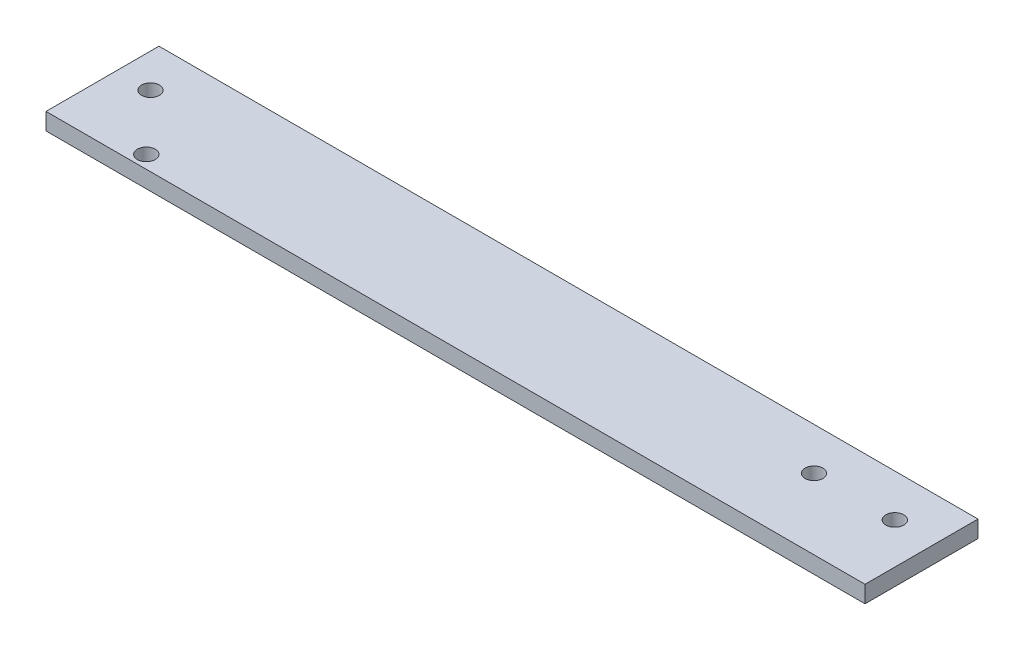
ISO-10303-21;
HEADER;
FILE_DESCRIPTION(('STEP AP214'),'2;1');
FILE_NAME('part.step','',(''),(''),'','','');
FILE_SCHEMA(('AUTOMOTIVE_DESIGN { 1 0 10303 214 1 1 1 1 }'));
ENDSEC;
DATA;
#1=APPLICATION_CONTEXT('core data for automotive mechanical design processes');
#2=APPLICATION_PROTOCOL_DEFINITION('international standard','automotive_design',2000,#1);
#3=PRODUCT_CONTEXT('',#1,'mechanical');
#4=PRODUCT('Part','Part','',(#3));
#5=PRODUCT_RELATED_PRODUCT_CATEGORY('part','',(#4));
#6=PRODUCT_DEFINITION_FORMATION('','',#4);
#7=PRODUCT_DEFINITION_CONTEXT('part definition',#1,'design');
#8=PRODUCT_DEFINITION('design','',#6,#7);
#9=PRODUCT_DEFINITION_SHAPE('','',#8);
#10=(LENGTH_UNIT() NAMED_UNIT(*) SI_UNIT(.MILLI.,.METRE.));
#11=(NAMED_UNIT(*) PLANE_ANGLE_UNIT() SI_UNIT($,.RADIAN.));
#12=(NAMED_UNIT(*) SI_UNIT($,.STERADIAN.) SOLID_ANGLE_UNIT());
#13=UNCERTAINTY_MEASURE_WITH_UNIT(LENGTH_MEASURE(1.E-05),#10,'distance_accuracy_value','');
#14=(GEOMETRIC_REPRESENTATION_CONTEXT(3) GLOBAL_UNCERTAINTY_ASSIGNED_CONTEXT((#13)) GLOBAL_UNIT_ASSIGNED_CONTEXT((#10,
#11,#12)) REPRESENTATION_CONTEXT('',''));
#15=CARTESIAN_POINT('',(0.,0.,0.));
#16=DIRECTION('',(0.,0.,1.));
#17=DIRECTION('',(1.,0.,0.));
#18=AXIS2_PLACEMENT_3D('',#15,#16,#17);
#19=CARTESIAN_POINT('',(0.,3.,20.));
#20=DIRECTION('',(-1.,0.,0.));
#21=DIRECTION('',(0.,0.,1.));
#22=AXIS2_PLACEMENT_3D('',#19,#20,#21);
#23=PLANE('',#22);
#24=DIRECTION('',(0.,0.,-1.));
#25=VECTOR('',#24,1.);
#26=CARTESIAN_POINT('',(0.,0.,20.));
#27=LINE('',#26,#25);
#28=CARTESIAN_POINT('',(0.,0.,20.));
#29=VERTEX_POINT('',#28);
#30=CARTESIAN_POINT('',(0.,0.,0.));
#31=VERTEX_POINT('',#30);
#32=EDGE_CURVE('E95',#29,#31,#27,.T.);
#33=ORIENTED_EDGE('',*,*,#32,.T.);
#34=DIRECTION('',(0.,-1.,0.));
#35=VECTOR('',#34,1.);
#36=CARTESIAN_POINT('',(0.,3.,0.));
#37=LINE('',#36,#35);
#38=CARTESIAN_POINT('',(0.,3.,0.));
#39=VERTEX_POINT('',#38);
#40=EDGE_CURVE('E11',#39,#31,#37,.T.);
#41=ORIENTED_EDGE('',*,*,#40,.F.);
#42=DIRECTION('',(0.,0.,-1.));
#43=VECTOR('',#42,1.);
#44=CARTESIAN_POINT('',(0.,3.,20.));
#45=LINE('',#44,#43);
#46=CARTESIAN_POINT('',(0.,3.,20.));
#47=VERTEX_POINT('',#46);
#48=EDGE_CURVE('E81',#47,#39,#45,.T.);
#49=ORIENTED_EDGE('',*,*,#48,.F.);
#50=DIRECTION('',(0.,-1.,0.));
#51=VECTOR('',#50,1.);
#52=CARTESIAN_POINT('',(0.,3.,20.));
#53=LINE('',#52,#51);
#54=EDGE_CURVE('E91',#47,#29,#53,.T.);
#55=ORIENTED_EDGE('',*,*,#54,.T.);
#56=EDGE_LOOP('',(#33,#41,#49,#55));
#57=FACE_BOUND('',#56,.T.);
#58=ADVANCED_FACE('F31',(#57),#23,.F.);
#59=CARTESIAN_POINT('',(0.,3.,0.));
#60=DIRECTION('',(0.,0.,1.));
#61=DIRECTION('',(1.,0.,0.));
#62=AXIS2_PLACEMENT_3D('',#59,#60,#61);
#63=PLANE('',#62);
#64=DIRECTION('',(-1.,0.,0.));
#65=VECTOR('',#64,1.);
#66=CARTESIAN_POINT('',(0.,0.,0.));
#67=LINE('',#66,#65);
#68=CARTESIAN_POINT('',(-145.,0.,0.));
#69=VERTEX_POINT('',#68);
#70=EDGE_CURVE('E86',#31,#69,#67,.T.);
#71=ORIENTED_EDGE('',*,*,#70,.T.);
#72=DIRECTION('',(0.,-1.,0.));
#73=VECTOR('',#72,1.);
#74=CARTESIAN_POINT('',(-145.,3.,0.));
#75=LINE('',#74,#73);
#76=CARTESIAN_POINT('',(-145.,3.,0.));
#77=VERTEX_POINT('',#76);
#78=EDGE_CURVE('E39',#77,#69,#75,.T.);
#79=ORIENTED_EDGE('',*,*,#78,.F.);
#80=DIRECTION('',(-1.,0.,0.));
#81=VECTOR('',#80,1.);
#82=CARTESIAN_POINT('',(0.,3.,0.));
#83=LINE('',#82,#81);
#84=EDGE_CURVE('E75',#39,#77,#83,.T.);
#85=ORIENTED_EDGE('',*,*,#84,.F.);
#86=ORIENTED_EDGE('',*,*,#40,.T.);
#87=EDGE_LOOP('',(#71,#79,#85,#86));
#88=FACE_BOUND('',#87,.T.);
#89=ADVANCED_FACE('F85',(#88),#63,.F.);
#90=CARTESIAN_POINT('',(-145.,3.,0.));
#91=DIRECTION('',(1.,0.,0.));
#92=DIRECTION('',(0.,0.,-1.));
#93=AXIS2_PLACEMENT_3D('',#90,#91,#92);
#94=PLANE('',#93);
#95=DIRECTION('',(0.,0.,1.));
#96=VECTOR('',#95,1.);
#97=CARTESIAN_POINT('',(-145.,0.,0.));
#98=LINE('',#97,#96);
#99=CARTESIAN_POINT('',(-145.,0.,20.));
#100=VERTEX_POINT('',#99);
#101=EDGE_CURVE('E100',#69,#100,#98,.T.);
#102=ORIENTED_EDGE('',*,*,#101,.T.);
#103=DIRECTION('',(0.,-1.,0.));
#104=VECTOR('',#103,1.);
#105=CARTESIAN_POINT('',(-145.,3.,20.));
#106=LINE('',#105,#104);
#107=CARTESIAN_POINT('',(-145.,3.,20.));
#108=VERTEX_POINT('',#107);
#109=EDGE_CURVE('E88',#108,#100,#106,.T.);
#110=ORIENTED_EDGE('',*,*,#109,.F.);
#111=DIRECTION('',(0.,0.,1.));
#112=VECTOR('',#111,1.);
#113=CARTESIAN_POINT('',(-145.,3.,0.));
#114=LINE('',#113,#112);
#115=EDGE_CURVE('E78',#77,#108,#114,.T.);
#116=ORIENTED_EDGE('',*,*,#115,.F.);
#117=ORIENTED_EDGE('',*,*,#78,.T.);
#118=EDGE_LOOP('',(#102,#110,#116,#117));
#119=FACE_BOUND('',#118,.T.);
#120=ADVANCED_FACE('F89',(#119),#94,.F.);
#121=CARTESIAN_POINT('',(-24.,3.,20.));
#122=DIRECTION('',(0.,0.,-1.));
#123=DIRECTION('',(-1.,0.,0.));
#124=AXIS2_PLACEMENT_3D('',#121,#122,#123);
#125=PLANE('',#124);
#126=DIRECTION('',(1.,0.,0.));
#127=VECTOR('',#126,1.);
#128=CARTESIAN_POINT('',(-24.,0.,20.));
#129=LINE('',#128,#127);
#130=EDGE_CURVE('E64',#100,#29,#129,.T.);
#131=ORIENTED_EDGE('',*,*,#130,.T.);
#132=ORIENTED_EDGE('',*,*,#54,.F.);
#133=DIRECTION('',(1.,0.,0.));
#134=VECTOR('',#133,1.);
#135=CARTESIAN_POINT('',(-145.,3.,20.));
#136=LINE('',#135,#134);
#137=EDGE_CURVE('E47',#108,#47,#136,.T.);
#138=ORIENTED_EDGE('',*,*,#137,.F.);
#139=ORIENTED_EDGE('',*,*,#109,.T.);
#140=EDGE_LOOP('',(#131,#132,#138,#139));
#141=FACE_BOUND('',#140,.T.);
#142=ADVANCED_FACE('F104',(#141),#125,.F.);
#143=CARTESIAN_POINT('',(0.,3.,0.));
#144=DIRECTION('',(0.,1.,0.));
#145=DIRECTION('',(0.,0.,1.));
#146=AXIS2_PLACEMENT_3D('',#143,#144,#145);
#147=PLANE('',#146);
#148=CARTESIAN_POINT('',(-129.5348,3.,17.71));
#149=DIRECTION('',(0.,1.,0.));
#150=DIRECTION('',(0.,0.,1.));
#151=AXIS2_PLACEMENT_3D('',#148,#149,#150);
#152=CIRCLE('',#151,1.59000000000001);
#153=CARTESIAN_POINT('',(-129.5348,3.,19.3));
#154=VERTEX_POINT('',#153);
#155=EDGE_CURVE('E127',#154,#154,#152,.T.);
#156=ORIENTED_EDGE('',*,*,#155,.F.);
#157=EDGE_LOOP('',(#156));
#158=FACE_BOUND('',#157,.T.);
#159=CARTESIAN_POINT('',(-21.5348,3.,7.49999999999998));
#160=DIRECTION('',(0.,1.,0.));
#161=DIRECTION('',(0.,0.,1.));
#162=AXIS2_PLACEMENT_3D('',#159,#160,#161);
#163=CIRCLE('',#162,1.59);
#164=CARTESIAN_POINT('',(-21.5348,3.,9.08999999999999));
#165=VERTEX_POINT('',#164);
#166=EDGE_CURVE('E121',#165,#165,#163,.T.);
#167=ORIENTED_EDGE('',*,*,#166,.F.);
#168=EDGE_LOOP('',(#167));
#169=FACE_BOUND('',#168,.T.);
#170=CARTESIAN_POINT('',(-7.22479999999998,3.,7.49999999999998));
#171=DIRECTION('',(0.,1.,0.));
#172=DIRECTION('',(0.,0.,1.));
#173=AXIS2_PLACEMENT_3D('',#170,#171,#172);
#174=CIRCLE('',#173,1.5875);
#175=CARTESIAN_POINT('',(-7.22479999999998,3.,9.08749999999998));
#176=VERTEX_POINT('',#175);
#177=EDGE_CURVE('E115',#176,#176,#174,.T.);
#178=ORIENTED_EDGE('',*,*,#177,.F.);
#179=EDGE_LOOP('',(#178));
#180=FACE_BOUND('',#179,.T.);
#181=CARTESIAN_POINT('',(-139.,3.,7.49999999999998));
#182=DIRECTION('',(0.,1.,0.));
#183=DIRECTION('',(0.,0.,1.));
#184=AXIS2_PLACEMENT_3D('',#181,#182,#183);
#185=CIRCLE('',#184,1.58749999999999);
#186=CARTESIAN_POINT('',(-139.,3.,9.08749999999997));
#187=VERTEX_POINT('',#186);
#188=EDGE_CURVE('E109',#187,#187,#185,.T.);
#189=ORIENTED_EDGE('',*,*,#188,.F.);
#190=EDGE_LOOP('',(#189));
#191=FACE_BOUND('',#190,.T.);
#192=ORIENTED_EDGE('',*,*,#48,.T.);
#193=ORIENTED_EDGE('',*,*,#84,.T.);
#194=ORIENTED_EDGE('',*,*,#115,.T.);
#195=ORIENTED_EDGE('',*,*,#137,.T.);
#196=EDGE_LOOP('',(#192,#193,#194,#195));
#197=FACE_BOUND('',#196,.T.);
#198=ADVANCED_FACE('F76',(#158,#169,#180,#191,#197),#147,.T.);
#199=CARTESIAN_POINT('',(0.,0.,0.));
#200=DIRECTION('',(0.,1.,0.));
#201=DIRECTION('',(0.,0.,1.));
#202=AXIS2_PLACEMENT_3D('',#199,#200,#201);
#203=PLANE('',#202);
#204=CARTESIAN_POINT('',(-129.5348,0.,17.71));
#205=DIRECTION('',(0.,1.,0.));
#206=DIRECTION('',(0.,0.,1.));
#207=AXIS2_PLACEMENT_3D('',#204,#205,#206);
#208=CIRCLE('',#207,1.59000000000001);
#209=CARTESIAN_POINT('',(-129.5348,0.,19.3));
#210=VERTEX_POINT('',#209);
#211=EDGE_CURVE('E124',#210,#210,#208,.F.);
#212=ORIENTED_EDGE('',*,*,#211,.F.);
#213=EDGE_LOOP('',(#212));
#214=FACE_BOUND('',#213,.T.);
#215=CARTESIAN_POINT('',(-21.5348,0.,7.49999999999998));
#216=DIRECTION('',(0.,1.,0.));
#217=DIRECTION('',(0.,0.,1.));
#218=AXIS2_PLACEMENT_3D('',#215,#216,#217);
#219=CIRCLE('',#218,1.59);
#220=CARTESIAN_POINT('',(-21.5348,0.,9.08999999999999));
#221=VERTEX_POINT('',#220);
#222=EDGE_CURVE('E118',#221,#221,#219,.F.);
#223=ORIENTED_EDGE('',*,*,#222,.F.);
#224=EDGE_LOOP('',(#223));
#225=FACE_BOUND('',#224,.T.);
#226=CARTESIAN_POINT('',(-7.22479999999998,0.,7.49999999999998));
#227=DIRECTION('',(0.,1.,0.));
#228=DIRECTION('',(0.,0.,1.));
#229=AXIS2_PLACEMENT_3D('',#226,#227,#228);
#230=CIRCLE('',#229,1.5875);
#231=CARTESIAN_POINT('',(-7.22479999999998,0.,9.08749999999998));
#232=VERTEX_POINT('',#231);
#233=EDGE_CURVE('E112',#232,#232,#230,.F.);
#234=ORIENTED_EDGE('',*,*,#233,.F.);
#235=EDGE_LOOP('',(#234));
#236=FACE_BOUND('',#235,.T.);
#237=CARTESIAN_POINT('',(-139.,0.,7.49999999999998));
#238=DIRECTION('',(0.,1.,0.));
#239=DIRECTION('',(0.,0.,1.));
#240=AXIS2_PLACEMENT_3D('',#237,#238,#239);
#241=CIRCLE('',#240,1.58749999999999);
#242=CARTESIAN_POINT('',(-139.,0.,9.08749999999997));
#243=VERTEX_POINT('',#242);
#244=EDGE_CURVE('E98',#243,#243,#241,.F.);
#245=ORIENTED_EDGE('',*,*,#244,.F.);
#246=EDGE_LOOP('',(#245));
#247=FACE_BOUND('',#246,.T.);
#248=ORIENTED_EDGE('',*,*,#32,.F.);
#249=ORIENTED_EDGE('',*,*,#130,.F.);
#250=ORIENTED_EDGE('',*,*,#101,.F.);
#251=ORIENTED_EDGE('',*,*,#70,.F.);
#252=EDGE_LOOP('',(#248,#249,#250,#251));
#253=FACE_BOUND('',#252,.T.);
#254=ADVANCED_FACE('F135',(#214,#225,#236,#247,#253),#203,.F.);
#255=CARTESIAN_POINT('',(-139.,-4.49012806053458,7.49999999999998));
#256=DIRECTION('',(0.,1.,0.));
#257=DIRECTION('',(0.,0.,1.));
#258=AXIS2_PLACEMENT_3D('',#255,#256,#257);
#259=CYLINDRICAL_SURFACE('',#258,1.58749999999999);
#260=ORIENTED_EDGE('',*,*,#244,.T.);
#261=EDGE_LOOP('',(#260));
#262=FACE_BOUND('',#261,.T.);
#263=ORIENTED_EDGE('',*,*,#188,.T.);
#264=EDGE_LOOP('',(#263));
#265=FACE_BOUND('',#264,.T.);
#266=ADVANCED_FACE('F143',(#262,#265),#259,.F.);
#267=CARTESIAN_POINT('',(-7.22479999999998,-4.49012806053458,7.49999999999998));
#268=DIRECTION('',(0.,1.,0.));
#269=DIRECTION('',(0.,0.,1.));
#270=AXIS2_PLACEMENT_3D('',#267,#268,#269);
#271=CYLINDRICAL_SURFACE('',#270,1.5875);
#272=ORIENTED_EDGE('',*,*,#233,.T.);
#273=EDGE_LOOP('',(#272));
#274=FACE_BOUND('',#273,.T.);
#275=ORIENTED_EDGE('',*,*,#177,.T.);
#276=EDGE_LOOP('',(#275));
#277=FACE_BOUND('',#276,.T.);
#278=ADVANCED_FACE('F145',(#274,#277),#271,.F.);
#279=CARTESIAN_POINT('',(-21.5348,-4.49719912834645,7.49999999999998));
#280=DIRECTION('',(0.,1.,0.));
#281=DIRECTION('',(0.,0.,1.));
#282=AXIS2_PLACEMENT_3D('',#279,#280,#281);
#283=CYLINDRICAL_SURFACE('',#282,1.59);
#284=ORIENTED_EDGE('',*,*,#222,.T.);
#285=EDGE_LOOP('',(#284));
#286=FACE_BOUND('',#285,.T.);
#287=ORIENTED_EDGE('',*,*,#166,.T.);
#288=EDGE_LOOP('',(#287));
#289=FACE_BOUND('',#288,.T.);
#290=ADVANCED_FACE('F152',(#286,#289),#283,.F.);
#291=CARTESIAN_POINT('',(-129.5348,-4.49719912834647,17.71));
#292=DIRECTION('',(0.,1.,0.));
#293=DIRECTION('',(0.,0.,1.));
#294=AXIS2_PLACEMENT_3D('',#291,#292,#293);
#295=CYLINDRICAL_SURFACE('',#294,1.59000000000001);
#296=ORIENTED_EDGE('',*,*,#211,.T.);
#297=EDGE_LOOP('',(#296));
#298=FACE_BOUND('',#297,.T.);
#299=ORIENTED_EDGE('',*,*,#155,.T.);
#300=EDGE_LOOP('',(#299));
#301=FACE_BOUND('',#300,.T.);
#302=ADVANCED_FACE('F131',(#298,#301),#295,.F.);
#303=CLOSED_SHELL('',(#58,#89,#120,#142,#198,#254,#266,#278,#290,#302));
#304=MANIFOLD_SOLID_BREP('B2',#303);
#305=ADVANCED_BREP_SHAPE_REPRESENTATION('',(#18,#304),#14);
#306=SHAPE_DEFINITION_REPRESENTATION(#9,#305);
ENDSEC;
END-ISO-10303-21;
